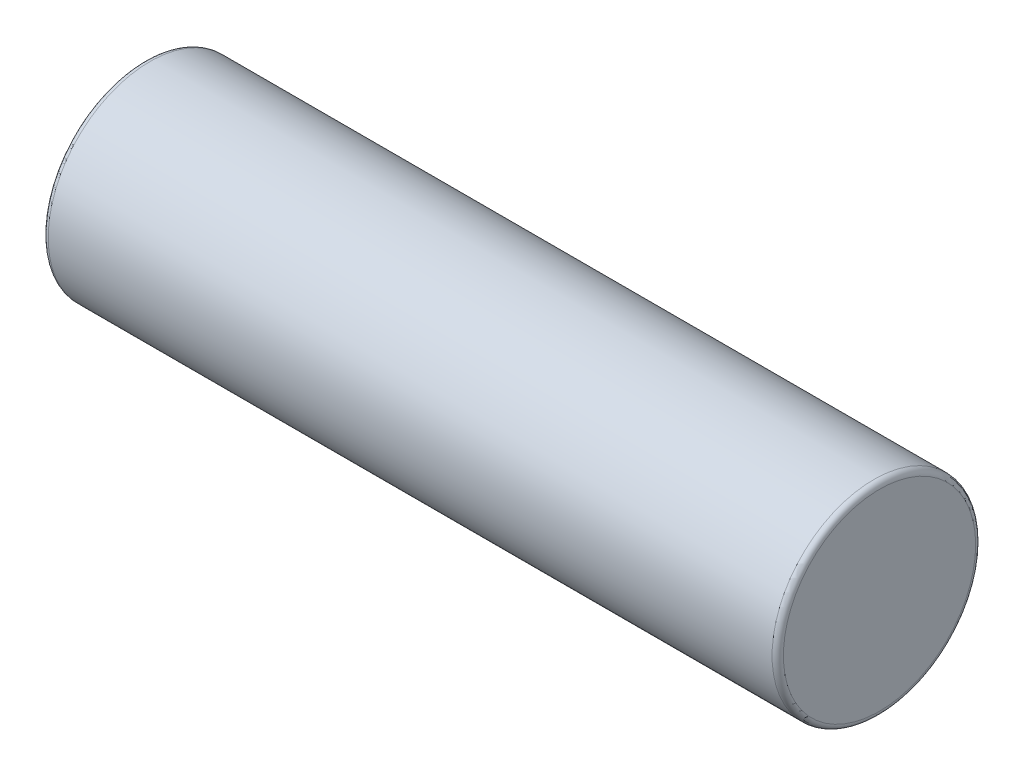
ISO-10303-21;
HEADER;
FILE_DESCRIPTION(('STEP AP214'),'2;1');
FILE_NAME('part.step','',(''),(''),'','','');
FILE_SCHEMA(('AUTOMOTIVE_DESIGN { 1 0 10303 214 1 1 1 1 }'));
ENDSEC;
DATA;
#1=APPLICATION_CONTEXT('core data for automotive mechanical design processes');
#2=APPLICATION_PROTOCOL_DEFINITION('international standard','automotive_design',2000,#1);
#3=PRODUCT_CONTEXT('',#1,'mechanical');
#4=PRODUCT('Part','Part','',(#3));
#5=PRODUCT_RELATED_PRODUCT_CATEGORY('part','',(#4));
#6=PRODUCT_DEFINITION_FORMATION('','',#4);
#7=PRODUCT_DEFINITION_CONTEXT('part definition',#1,'design');
#8=PRODUCT_DEFINITION('design','',#6,#7);
#9=PRODUCT_DEFINITION_SHAPE('','',#8);
#10=(LENGTH_UNIT() NAMED_UNIT(*) SI_UNIT(.MILLI.,.METRE.));
#11=(NAMED_UNIT(*) PLANE_ANGLE_UNIT() SI_UNIT($,.RADIAN.));
#12=(NAMED_UNIT(*) SI_UNIT($,.STERADIAN.) SOLID_ANGLE_UNIT());
#13=UNCERTAINTY_MEASURE_WITH_UNIT(LENGTH_MEASURE(1.E-05),#10,'distance_accuracy_value','');
#14=(GEOMETRIC_REPRESENTATION_CONTEXT(3) GLOBAL_UNCERTAINTY_ASSIGNED_CONTEXT((#13)) GLOBAL_UNIT_ASSIGNED_CONTEXT((#10,
#11,#12)) REPRESENTATION_CONTEXT('',''));
#15=CARTESIAN_POINT('',(0.,0.,0.));
#16=DIRECTION('',(0.,0.,1.));
#17=DIRECTION('',(1.,0.,0.));
#18=AXIS2_PLACEMENT_3D('',#15,#16,#17);
#19=CARTESIAN_POINT('',(-65.,0.,0.));
#20=DIRECTION('',(1.,0.,0.));
#21=DIRECTION('',(0.,0.,-1.));
#22=AXIS2_PLACEMENT_3D('',#19,#20,#21);
#23=CYLINDRICAL_SURFACE('',#22,9.);
#24=CARTESIAN_POINT('',(-0.5,0.,0.));
#25=DIRECTION('',(1.,0.,0.));
#26=DIRECTION('',(0.,0.,-1.));
#27=AXIS2_PLACEMENT_3D('',#24,#25,#26);
#28=CIRCLE('',#27,9.);
#29=CARTESIAN_POINT('',(-0.5,0.,-9.));
#30=VERTEX_POINT('',#29);
#31=EDGE_CURVE('E40',#30,#30,#28,.F.);
#32=ORIENTED_EDGE('',*,*,#31,.T.);
#33=EDGE_LOOP('',(#32));
#34=FACE_BOUND('',#33,.T.);
#35=CARTESIAN_POINT('',(-64.5,0.,0.));
#36=DIRECTION('',(1.,0.,0.));
#37=DIRECTION('',(0.,0.,-1.));
#38=AXIS2_PLACEMENT_3D('',#35,#36,#37);
#39=CIRCLE('',#38,9.);
#40=CARTESIAN_POINT('',(-64.5,0.,-9.));
#41=VERTEX_POINT('',#40);
#42=EDGE_CURVE('E44',#41,#41,#39,.T.);
#43=ORIENTED_EDGE('',*,*,#42,.T.);
#44=EDGE_LOOP('',(#43));
#45=FACE_BOUND('',#44,.T.);
#46=ADVANCED_FACE('F33',(#34,#45),#23,.T.);
#47=CARTESIAN_POINT('',(-65.,0.,0.));
#48=DIRECTION('',(1.,0.,0.));
#49=DIRECTION('',(0.,0.,-1.));
#50=AXIS2_PLACEMENT_3D('',#47,#48,#49);
#51=PLANE('',#50);
#52=CARTESIAN_POINT('',(-65.,0.,0.));
#53=DIRECTION('',(1.,0.,0.));
#54=DIRECTION('',(0.,0.,-1.));
#55=AXIS2_PLACEMENT_3D('',#52,#53,#54);
#56=CIRCLE('',#55,8.5);
#57=CARTESIAN_POINT('',(-65.,0.,-8.5));
#58=VERTEX_POINT('',#57);
#59=EDGE_CURVE('E10',#58,#58,#56,.F.);
#60=ORIENTED_EDGE('',*,*,#59,.T.);
#61=EDGE_LOOP('',(#60));
#62=FACE_BOUND('',#61,.T.);
#63=ADVANCED_FACE('F64',(#62),#51,.F.);
#64=CARTESIAN_POINT('',(0.,0.,0.));
#65=DIRECTION('',(1.,0.,0.));
#66=DIRECTION('',(0.,0.,-1.));
#67=AXIS2_PLACEMENT_3D('',#64,#65,#66);
#68=PLANE('',#67);
#69=CARTESIAN_POINT('',(0.,0.,0.));
#70=DIRECTION('',(1.,0.,0.));
#71=DIRECTION('',(0.,0.,-1.));
#72=AXIS2_PLACEMENT_3D('',#69,#70,#71);
#73=CIRCLE('',#72,8.5);
#74=CARTESIAN_POINT('',(0.,0.,-8.5));
#75=VERTEX_POINT('',#74);
#76=EDGE_CURVE('E48',#75,#75,#73,.T.);
#77=ORIENTED_EDGE('',*,*,#76,.T.);
#78=EDGE_LOOP('',(#77));
#79=FACE_BOUND('',#78,.T.);
#80=ADVANCED_FACE('F54',(#79),#68,.T.);
#81=CARTESIAN_POINT('',(-0.5,0.,0.));
#82=DIRECTION('',(1.,0.,0.));
#83=DIRECTION('',(0.,0.,-1.));
#84=AXIS2_PLACEMENT_3D('',#81,#82,#83);
#85=TOROIDAL_SURFACE('',#84,8.5,0.5);
#86=ORIENTED_EDGE('',*,*,#31,.F.);
#87=EDGE_LOOP('',(#86));
#88=FACE_BOUND('',#87,.T.);
#89=ORIENTED_EDGE('',*,*,#76,.F.);
#90=EDGE_LOOP('',(#89));
#91=FACE_BOUND('',#90,.T.);
#92=ADVANCED_FACE('F56',(#88,#91),#85,.T.);
#93=CARTESIAN_POINT('',(-64.5,0.,0.));
#94=DIRECTION('',(1.,0.,0.));
#95=DIRECTION('',(0.,0.,-1.));
#96=AXIS2_PLACEMENT_3D('',#93,#94,#95);
#97=TOROIDAL_SURFACE('',#96,8.5,0.5);
#98=ORIENTED_EDGE('',*,*,#59,.F.);
#99=EDGE_LOOP('',(#98));
#100=FACE_BOUND('',#99,.T.);
#101=ORIENTED_EDGE('',*,*,#42,.F.);
#102=EDGE_LOOP('',(#101));
#103=FACE_BOUND('',#102,.T.);
#104=ADVANCED_FACE('F35',(#100,#103),#97,.T.);
#105=CLOSED_SHELL('',(#46,#63,#80,#92,#104));
#106=MANIFOLD_SOLID_BREP('B2',#105);
#107=ADVANCED_BREP_SHAPE_REPRESENTATION('',(#18,#106),#14);
#108=SHAPE_DEFINITION_REPRESENTATION(#9,#107);
ENDSEC;
END-ISO-10303-21;
